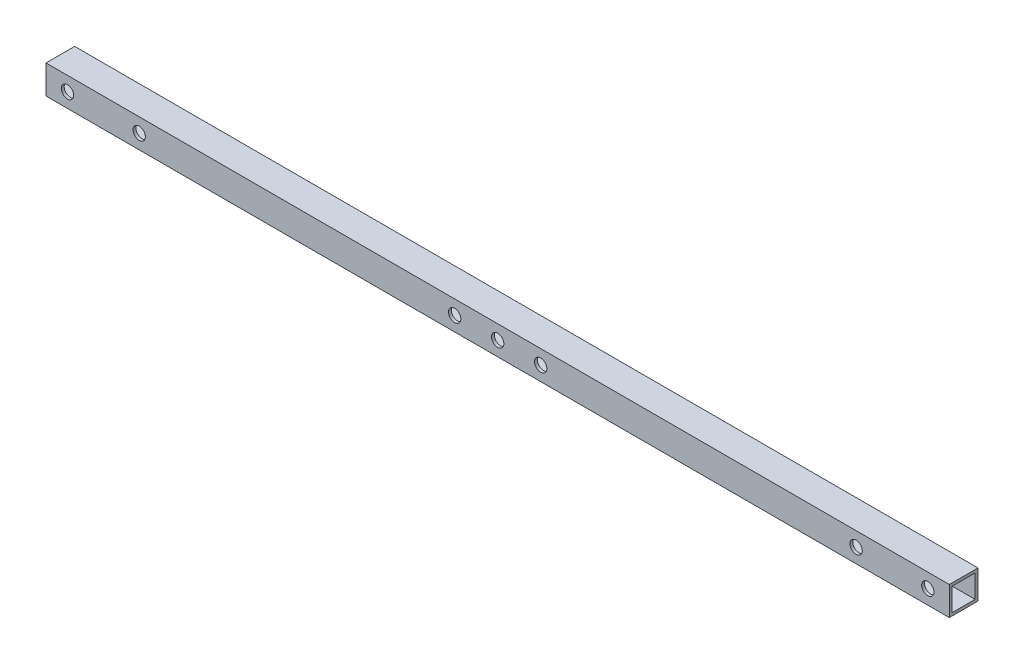
ISO-10303-21;
HEADER;
FILE_DESCRIPTION(('STEP AP214'),'2;1');
FILE_NAME('part.step','',(''),(''),'','','');
FILE_SCHEMA(('AUTOMOTIVE_DESIGN { 1 0 10303 214 1 1 1 1 }'));
ENDSEC;
DATA;
#1=APPLICATION_CONTEXT('core data for automotive mechanical design processes');
#2=APPLICATION_PROTOCOL_DEFINITION('international standard','automotive_design',2000,#1);
#3=PRODUCT_CONTEXT('',#1,'mechanical');
#4=PRODUCT('Part','Part','',(#3));
#5=PRODUCT_RELATED_PRODUCT_CATEGORY('part','',(#4));
#6=PRODUCT_DEFINITION_FORMATION('','',#4);
#7=PRODUCT_DEFINITION_CONTEXT('part definition',#1,'design');
#8=PRODUCT_DEFINITION('design','',#6,#7);
#9=PRODUCT_DEFINITION_SHAPE('','',#8);
#10=(LENGTH_UNIT() NAMED_UNIT(*) SI_UNIT(.MILLI.,.METRE.));
#11=(NAMED_UNIT(*) PLANE_ANGLE_UNIT() SI_UNIT($,.RADIAN.));
#12=(NAMED_UNIT(*) SI_UNIT($,.STERADIAN.) SOLID_ANGLE_UNIT());
#13=UNCERTAINTY_MEASURE_WITH_UNIT(LENGTH_MEASURE(1.E-05),#10,'distance_accuracy_value','');
#14=(GEOMETRIC_REPRESENTATION_CONTEXT(3) GLOBAL_UNCERTAINTY_ASSIGNED_CONTEXT((#13)) GLOBAL_UNIT_ASSIGNED_CONTEXT((#10,
#11,#12)) REPRESENTATION_CONTEXT('',''));
#15=CARTESIAN_POINT('',(0.,0.,0.));
#16=DIRECTION('',(0.,0.,1.));
#17=DIRECTION('',(1.,0.,0.));
#18=AXIS2_PLACEMENT_3D('',#15,#16,#17);
#19=CARTESIAN_POINT('',(315.,0.,0.));
#20=DIRECTION('',(1.,0.,0.));
#21=DIRECTION('',(0.,0.,-1.));
#22=AXIS2_PLACEMENT_3D('',#19,#20,#21);
#23=PLANE('',#22);
#24=DIRECTION('',(0.,1.,0.));
#25=VECTOR('',#24,1.);
#26=CARTESIAN_POINT('',(315.,5.,-5.));
#27=LINE('',#26,#25);
#28=CARTESIAN_POINT('',(315.,-5.,-5.));
#29=VERTEX_POINT('',#28);
#30=CARTESIAN_POINT('',(315.,5.,-5.));
#31=VERTEX_POINT('',#30);
#32=EDGE_CURVE('E164',#29,#31,#27,.T.);
#33=ORIENTED_EDGE('',*,*,#32,.T.);
#34=DIRECTION('',(0.,0.,1.));
#35=VECTOR('',#34,1.);
#36=CARTESIAN_POINT('',(315.,5.,5.));
#37=LINE('',#36,#35);
#38=CARTESIAN_POINT('',(315.,5.,5.));
#39=VERTEX_POINT('',#38);
#40=EDGE_CURVE('E167',#31,#39,#37,.T.);
#41=ORIENTED_EDGE('',*,*,#40,.T.);
#42=DIRECTION('',(0.,-1.,0.));
#43=VECTOR('',#42,1.);
#44=CARTESIAN_POINT('',(315.,5.,5.));
#45=LINE('',#44,#43);
#46=CARTESIAN_POINT('',(315.,-5.,5.));
#47=VERTEX_POINT('',#46);
#48=EDGE_CURVE('E170',#39,#47,#45,.T.);
#49=ORIENTED_EDGE('',*,*,#48,.T.);
#50=DIRECTION('',(0.,0.,-1.));
#51=VECTOR('',#50,1.);
#52=CARTESIAN_POINT('',(315.,-5.,5.));
#53=LINE('',#52,#51);
#54=EDGE_CURVE('E172',#47,#29,#53,.T.);
#55=ORIENTED_EDGE('',*,*,#54,.T.);
#56=EDGE_LOOP('',(#33,#41,#49,#55));
#57=FACE_BOUND('',#56,.T.);
#58=DIRECTION('',(0.,0.,1.));
#59=VECTOR('',#58,1.);
#60=CARTESIAN_POINT('',(315.,4.,5.));
#61=LINE('',#60,#59);
#62=CARTESIAN_POINT('',(315.,4.,-4.));
#63=VERTEX_POINT('',#62);
#64=CARTESIAN_POINT('',(315.,4.,4.));
#65=VERTEX_POINT('',#64);
#66=EDGE_CURVE('E134',#63,#65,#61,.T.);
#67=ORIENTED_EDGE('',*,*,#66,.F.);
#68=DIRECTION('',(0.,1.,0.));
#69=VECTOR('',#68,1.);
#70=CARTESIAN_POINT('',(315.,5.,-4.));
#71=LINE('',#70,#69);
#72=CARTESIAN_POINT('',(315.,-4.,-4.));
#73=VERTEX_POINT('',#72);
#74=EDGE_CURVE('E126',#73,#63,#71,.T.);
#75=ORIENTED_EDGE('',*,*,#74,.F.);
#76=DIRECTION('',(0.,0.,-1.));
#77=VECTOR('',#76,1.);
#78=CARTESIAN_POINT('',(315.,-4.,5.));
#79=LINE('',#78,#77);
#80=CARTESIAN_POINT('',(315.,-4.,4.));
#81=VERTEX_POINT('',#80);
#82=EDGE_CURVE('E148',#81,#73,#79,.T.);
#83=ORIENTED_EDGE('',*,*,#82,.F.);
#84=DIRECTION('',(0.,-1.,0.));
#85=VECTOR('',#84,1.);
#86=CARTESIAN_POINT('',(315.,5.,4.));
#87=LINE('',#86,#85);
#88=EDGE_CURVE('E146',#65,#81,#87,.T.);
#89=ORIENTED_EDGE('',*,*,#88,.F.);
#90=EDGE_LOOP('',(#67,#75,#83,#89));
#91=FACE_BOUND('',#90,.T.);
#92=ADVANCED_FACE('F59',(#57,#91),#23,.T.);
#93=CARTESIAN_POINT('',(0.,0.,0.));
#94=DIRECTION('',(1.,0.,0.));
#95=DIRECTION('',(0.,0.,-1.));
#96=AXIS2_PLACEMENT_3D('',#93,#94,#95);
#97=PLANE('',#96);
#98=DIRECTION('',(0.,1.,0.));
#99=VECTOR('',#98,1.);
#100=CARTESIAN_POINT('',(0.,5.,-5.));
#101=LINE('',#100,#99);
#102=CARTESIAN_POINT('',(0.,-5.,-5.));
#103=VERTEX_POINT('',#102);
#104=CARTESIAN_POINT('',(0.,5.,-5.));
#105=VERTEX_POINT('',#104);
#106=EDGE_CURVE('E142',#103,#105,#101,.T.);
#107=ORIENTED_EDGE('',*,*,#106,.F.);
#108=DIRECTION('',(0.,0.,-1.));
#109=VECTOR('',#108,1.);
#110=CARTESIAN_POINT('',(0.,-5.,5.));
#111=LINE('',#110,#109);
#112=CARTESIAN_POINT('',(0.,-5.,5.));
#113=VERTEX_POINT('',#112);
#114=EDGE_CURVE('E168',#113,#103,#111,.T.);
#115=ORIENTED_EDGE('',*,*,#114,.F.);
#116=DIRECTION('',(0.,-1.,0.));
#117=VECTOR('',#116,1.);
#118=CARTESIAN_POINT('',(0.,5.,5.));
#119=LINE('',#118,#117);
#120=CARTESIAN_POINT('',(0.,5.,5.));
#121=VERTEX_POINT('',#120);
#122=EDGE_CURVE('E179',#121,#113,#119,.T.);
#123=ORIENTED_EDGE('',*,*,#122,.F.);
#124=DIRECTION('',(0.,0.,1.));
#125=VECTOR('',#124,1.);
#126=CARTESIAN_POINT('',(0.,5.,5.));
#127=LINE('',#126,#125);
#128=EDGE_CURVE('E177',#105,#121,#127,.T.);
#129=ORIENTED_EDGE('',*,*,#128,.F.);
#130=EDGE_LOOP('',(#107,#115,#123,#129));
#131=FACE_BOUND('',#130,.T.);
#132=DIRECTION('',(0.,1.,0.));
#133=VECTOR('',#132,1.);
#134=CARTESIAN_POINT('',(0.,5.,-4.));
#135=LINE('',#134,#133);
#136=CARTESIAN_POINT('',(0.,-4.,-4.));
#137=VERTEX_POINT('',#136);
#138=CARTESIAN_POINT('',(0.,4.,-4.));
#139=VERTEX_POINT('',#138);
#140=EDGE_CURVE('E84',#137,#139,#135,.T.);
#141=ORIENTED_EDGE('',*,*,#140,.T.);
#142=DIRECTION('',(0.,0.,1.));
#143=VECTOR('',#142,1.);
#144=CARTESIAN_POINT('',(0.,4.,5.));
#145=LINE('',#144,#143);
#146=CARTESIAN_POINT('',(0.,4.,4.));
#147=VERTEX_POINT('',#146);
#148=EDGE_CURVE('E141',#139,#147,#145,.T.);
#149=ORIENTED_EDGE('',*,*,#148,.T.);
#150=DIRECTION('',(0.,-1.,0.));
#151=VECTOR('',#150,1.);
#152=CARTESIAN_POINT('',(0.,5.,4.));
#153=LINE('',#152,#151);
#154=CARTESIAN_POINT('',(0.,-4.,4.));
#155=VERTEX_POINT('',#154);
#156=EDGE_CURVE('E156',#147,#155,#153,.T.);
#157=ORIENTED_EDGE('',*,*,#156,.T.);
#158=DIRECTION('',(0.,0.,-1.));
#159=VECTOR('',#158,1.);
#160=CARTESIAN_POINT('',(0.,-4.,5.));
#161=LINE('',#160,#159);
#162=EDGE_CURVE('E135',#155,#137,#161,.T.);
#163=ORIENTED_EDGE('',*,*,#162,.T.);
#164=EDGE_LOOP('',(#141,#149,#157,#163));
#165=FACE_BOUND('',#164,.T.);
#166=ADVANCED_FACE('F249',(#131,#165),#97,.F.);
#167=CARTESIAN_POINT('',(315.,5.,-5.));
#168=DIRECTION('',(0.,0.,1.));
#169=DIRECTION('',(0.,-1.,0.));
#170=AXIS2_PLACEMENT_3D('',#167,#168,#169);
#171=PLANE('',#170);
#172=CARTESIAN_POINT('',(307.5,0.,-5.));
#173=DIRECTION('',(0.,0.,1.));
#174=DIRECTION('',(1.,0.,0.));
#175=AXIS2_PLACEMENT_3D('',#172,#173,#174);
#176=CIRCLE('',#175,2.14999999999996);
#177=CARTESIAN_POINT('',(309.65,0.,-5.));
#178=VERTEX_POINT('',#177);
#179=EDGE_CURVE('E193',#178,#178,#176,.T.);
#180=ORIENTED_EDGE('',*,*,#179,.T.);
#181=EDGE_LOOP('',(#180));
#182=FACE_BOUND('',#181,.T.);
#183=CARTESIAN_POINT('',(142.5,0.,-5.));
#184=DIRECTION('',(0.,0.,1.));
#185=DIRECTION('',(-1.,0.,0.));
#186=AXIS2_PLACEMENT_3D('',#183,#184,#185);
#187=CIRCLE('',#186,2.14999999999996);
#188=CARTESIAN_POINT('',(140.35,0.,-5.));
#189=VERTEX_POINT('',#188);
#190=EDGE_CURVE('E306',#189,#189,#187,.T.);
#191=ORIENTED_EDGE('',*,*,#190,.T.);
#192=EDGE_LOOP('',(#191));
#193=FACE_BOUND('',#192,.T.);
#194=CARTESIAN_POINT('',(157.5,0.,-5.));
#195=DIRECTION('',(0.,0.,1.));
#196=DIRECTION('',(1.,0.,0.));
#197=AXIS2_PLACEMENT_3D('',#194,#195,#196);
#198=CIRCLE('',#197,2.15000000000002);
#199=CARTESIAN_POINT('',(159.65,0.,-5.));
#200=VERTEX_POINT('',#199);
#201=EDGE_CURVE('E310',#200,#200,#198,.T.);
#202=ORIENTED_EDGE('',*,*,#201,.T.);
#203=EDGE_LOOP('',(#202));
#204=FACE_BOUND('',#203,.T.);
#205=CARTESIAN_POINT('',(282.5,0.,-5.));
#206=DIRECTION('',(0.,0.,1.));
#207=DIRECTION('',(1.,0.,0.));
#208=AXIS2_PLACEMENT_3D('',#205,#206,#207);
#209=CIRCLE('',#208,2.14999999999996);
#210=CARTESIAN_POINT('',(284.65,0.,-5.));
#211=VERTEX_POINT('',#210);
#212=EDGE_CURVE('E314',#211,#211,#209,.T.);
#213=ORIENTED_EDGE('',*,*,#212,.T.);
#214=EDGE_LOOP('',(#213));
#215=FACE_BOUND('',#214,.T.);
#216=CARTESIAN_POINT('',(7.50000000000001,0.,-5.));
#217=DIRECTION('',(0.,0.,1.));
#218=DIRECTION('',(-1.,0.,0.));
#219=AXIS2_PLACEMENT_3D('',#216,#217,#218);
#220=CIRCLE('',#219,2.14999999999996);
#221=CARTESIAN_POINT('',(5.35000000000005,0.,-5.));
#222=VERTEX_POINT('',#221);
#223=EDGE_CURVE('E318',#222,#222,#220,.T.);
#224=ORIENTED_EDGE('',*,*,#223,.T.);
#225=EDGE_LOOP('',(#224));
#226=FACE_BOUND('',#225,.T.);
#227=CARTESIAN_POINT('',(32.5,0.,-5.));
#228=DIRECTION('',(0.,0.,1.));
#229=DIRECTION('',(-1.,0.,0.));
#230=AXIS2_PLACEMENT_3D('',#227,#228,#229);
#231=CIRCLE('',#230,2.14999999999996);
#232=CARTESIAN_POINT('',(30.3500000000001,0.,-5.));
#233=VERTEX_POINT('',#232);
#234=EDGE_CURVE('E322',#233,#233,#231,.T.);
#235=ORIENTED_EDGE('',*,*,#234,.T.);
#236=EDGE_LOOP('',(#235));
#237=FACE_BOUND('',#236,.T.);
#238=CARTESIAN_POINT('',(172.5,0.,-5.));
#239=DIRECTION('',(0.,0.,1.));
#240=DIRECTION('',(1.,0.,0.));
#241=AXIS2_PLACEMENT_3D('',#238,#239,#240);
#242=CIRCLE('',#241,2.14999999999996);
#243=CARTESIAN_POINT('',(174.65,0.,-5.));
#244=VERTEX_POINT('',#243);
#245=EDGE_CURVE('E325',#244,#244,#242,.T.);
#246=ORIENTED_EDGE('',*,*,#245,.T.);
#247=EDGE_LOOP('',(#246));
#248=FACE_BOUND('',#247,.T.);
#249=ORIENTED_EDGE('',*,*,#106,.T.);
#250=DIRECTION('',(-1.,0.,0.));
#251=VECTOR('',#250,1.);
#252=CARTESIAN_POINT('',(315.,5.,-5.));
#253=LINE('',#252,#251);
#254=EDGE_CURVE('E12',#31,#105,#253,.T.);
#255=ORIENTED_EDGE('',*,*,#254,.F.);
#256=ORIENTED_EDGE('',*,*,#32,.F.);
#257=DIRECTION('',(-1.,0.,0.));
#258=VECTOR('',#257,1.);
#259=CARTESIAN_POINT('',(315.,-5.,-5.));
#260=LINE('',#259,#258);
#261=EDGE_CURVE('E174',#29,#103,#260,.T.);
#262=ORIENTED_EDGE('',*,*,#261,.T.);
#263=EDGE_LOOP('',(#249,#255,#256,#262));
#264=FACE_BOUND('',#263,.T.);
#265=ADVANCED_FACE('F61',(#182,#193,#204,#215,#226,#237,#248,#264),#171,.F.);
#266=CARTESIAN_POINT('',(315.,5.,5.));
#267=DIRECTION('',(0.,-1.,0.));
#268=DIRECTION('',(0.,0.,-1.));
#269=AXIS2_PLACEMENT_3D('',#266,#267,#268);
#270=PLANE('',#269);
#271=ORIENTED_EDGE('',*,*,#128,.T.);
#272=DIRECTION('',(-1.,0.,0.));
#273=VECTOR('',#272,1.);
#274=CARTESIAN_POINT('',(315.,5.,5.));
#275=LINE('',#274,#273);
#276=EDGE_CURVE('E68',#39,#121,#275,.T.);
#277=ORIENTED_EDGE('',*,*,#276,.F.);
#278=ORIENTED_EDGE('',*,*,#40,.F.);
#279=ORIENTED_EDGE('',*,*,#254,.T.);
#280=EDGE_LOOP('',(#271,#277,#278,#279));
#281=FACE_BOUND('',#280,.T.);
#282=ADVANCED_FACE('F278',(#281),#270,.F.);
#283=CARTESIAN_POINT('',(315.,5.,5.));
#284=DIRECTION('',(0.,0.,-1.));
#285=DIRECTION('',(0.,1.,0.));
#286=AXIS2_PLACEMENT_3D('',#283,#284,#285);
#287=PLANE('',#286);
#288=CARTESIAN_POINT('',(307.5,0.,5.));
#289=DIRECTION('',(0.,0.,1.));
#290=DIRECTION('',(1.,0.,0.));
#291=AXIS2_PLACEMENT_3D('',#288,#289,#290);
#292=CIRCLE('',#291,2.14999999999996);
#293=CARTESIAN_POINT('',(309.65,0.,5.));
#294=VERTEX_POINT('',#293);
#295=EDGE_CURVE('E337',#294,#294,#292,.T.);
#296=ORIENTED_EDGE('',*,*,#295,.F.);
#297=EDGE_LOOP('',(#296));
#298=FACE_BOUND('',#297,.T.);
#299=CARTESIAN_POINT('',(142.5,0.,5.));
#300=DIRECTION('',(0.,0.,1.));
#301=DIRECTION('',(-1.,0.,0.));
#302=AXIS2_PLACEMENT_3D('',#299,#300,#301);
#303=CIRCLE('',#302,2.14999999999996);
#304=CARTESIAN_POINT('',(140.35,0.,5.));
#305=VERTEX_POINT('',#304);
#306=EDGE_CURVE('E419',#305,#305,#303,.T.);
#307=ORIENTED_EDGE('',*,*,#306,.F.);
#308=EDGE_LOOP('',(#307));
#309=FACE_BOUND('',#308,.T.);
#310=CARTESIAN_POINT('',(157.5,0.,5.));
#311=DIRECTION('',(0.,0.,1.));
#312=DIRECTION('',(1.,0.,0.));
#313=AXIS2_PLACEMENT_3D('',#310,#311,#312);
#314=CIRCLE('',#313,2.15000000000002);
#315=CARTESIAN_POINT('',(159.65,0.,5.));
#316=VERTEX_POINT('',#315);
#317=EDGE_CURVE('E415',#316,#316,#314,.T.);
#318=ORIENTED_EDGE('',*,*,#317,.F.);
#319=EDGE_LOOP('',(#318));
#320=FACE_BOUND('',#319,.T.);
#321=CARTESIAN_POINT('',(282.5,0.,5.));
#322=DIRECTION('',(0.,0.,1.));
#323=DIRECTION('',(1.,0.,0.));
#324=AXIS2_PLACEMENT_3D('',#321,#322,#323);
#325=CIRCLE('',#324,2.14999999999996);
#326=CARTESIAN_POINT('',(284.65,0.,5.));
#327=VERTEX_POINT('',#326);
#328=EDGE_CURVE('E338',#327,#327,#325,.T.);
#329=ORIENTED_EDGE('',*,*,#328,.F.);
#330=EDGE_LOOP('',(#329));
#331=FACE_BOUND('',#330,.T.);
#332=CARTESIAN_POINT('',(7.50000000000001,0.,5.));
#333=DIRECTION('',(0.,0.,1.));
#334=DIRECTION('',(-1.,0.,0.));
#335=AXIS2_PLACEMENT_3D('',#332,#333,#334);
#336=CIRCLE('',#335,2.14999999999996);
#337=CARTESIAN_POINT('',(5.35000000000005,0.,5.));
#338=VERTEX_POINT('',#337);
#339=EDGE_CURVE('E342',#338,#338,#336,.T.);
#340=ORIENTED_EDGE('',*,*,#339,.F.);
#341=EDGE_LOOP('',(#340));
#342=FACE_BOUND('',#341,.T.);
#343=CARTESIAN_POINT('',(32.5,0.,5.));
#344=DIRECTION('',(0.,0.,1.));
#345=DIRECTION('',(-1.,0.,0.));
#346=AXIS2_PLACEMENT_3D('',#343,#344,#345);
#347=CIRCLE('',#346,2.14999999999996);
#348=CARTESIAN_POINT('',(30.3500000000001,0.,5.));
#349=VERTEX_POINT('',#348);
#350=EDGE_CURVE('E327',#349,#349,#347,.T.);
#351=ORIENTED_EDGE('',*,*,#350,.F.);
#352=EDGE_LOOP('',(#351));
#353=FACE_BOUND('',#352,.T.);
#354=CARTESIAN_POINT('',(172.5,0.,5.));
#355=DIRECTION('',(0.,0.,1.));
#356=DIRECTION('',(1.,0.,0.));
#357=AXIS2_PLACEMENT_3D('',#354,#355,#356);
#358=CIRCLE('',#357,2.14999999999996);
#359=CARTESIAN_POINT('',(174.65,0.,5.));
#360=VERTEX_POINT('',#359);
#361=EDGE_CURVE('E328',#360,#360,#358,.T.);
#362=ORIENTED_EDGE('',*,*,#361,.F.);
#363=EDGE_LOOP('',(#362));
#364=FACE_BOUND('',#363,.T.);
#365=ORIENTED_EDGE('',*,*,#122,.T.);
#366=DIRECTION('',(-1.,0.,0.));
#367=VECTOR('',#366,1.);
#368=CARTESIAN_POINT('',(315.,-5.,5.));
#369=LINE('',#368,#367);
#370=EDGE_CURVE('E184',#47,#113,#369,.T.);
#371=ORIENTED_EDGE('',*,*,#370,.F.);
#372=ORIENTED_EDGE('',*,*,#48,.F.);
#373=ORIENTED_EDGE('',*,*,#276,.T.);
#374=EDGE_LOOP('',(#365,#371,#372,#373));
#375=FACE_BOUND('',#374,.T.);
#376=ADVANCED_FACE('F275',(#298,#309,#320,#331,#342,#353,#364,#375),#287,.F.);
#377=CARTESIAN_POINT('',(315.,-5.,5.));
#378=DIRECTION('',(0.,1.,0.));
#379=DIRECTION('',(0.,0.,1.));
#380=AXIS2_PLACEMENT_3D('',#377,#378,#379);
#381=PLANE('',#380);
#382=ORIENTED_EDGE('',*,*,#114,.T.);
#383=ORIENTED_EDGE('',*,*,#261,.F.);
#384=ORIENTED_EDGE('',*,*,#54,.F.);
#385=ORIENTED_EDGE('',*,*,#370,.T.);
#386=EDGE_LOOP('',(#382,#383,#384,#385));
#387=FACE_BOUND('',#386,.T.);
#388=ADVANCED_FACE('F272',(#387),#381,.F.);
#389=CARTESIAN_POINT('',(315.,5.,-4.));
#390=DIRECTION('',(0.,0.,1.));
#391=DIRECTION('',(0.,-1.,0.));
#392=AXIS2_PLACEMENT_3D('',#389,#390,#391);
#393=PLANE('',#392);
#394=CARTESIAN_POINT('',(307.5,0.,-4.));
#395=DIRECTION('',(0.,0.,1.));
#396=DIRECTION('',(0.,-1.,0.));
#397=AXIS2_PLACEMENT_3D('',#394,#395,#396);
#398=CIRCLE('',#397,2.14999999999996);
#399=CARTESIAN_POINT('',(307.5,-2.14999999999998,-4.));
#400=VERTEX_POINT('',#399);
#401=EDGE_CURVE('E154',#400,#400,#398,.T.);
#402=ORIENTED_EDGE('',*,*,#401,.F.);
#403=EDGE_LOOP('',(#402));
#404=FACE_BOUND('',#403,.T.);
#405=CARTESIAN_POINT('',(142.5,0.,-4.));
#406=DIRECTION('',(0.,0.,1.));
#407=DIRECTION('',(0.,-1.,0.));
#408=AXIS2_PLACEMENT_3D('',#405,#406,#407);
#409=CIRCLE('',#408,2.14999999999996);
#410=CARTESIAN_POINT('',(142.5,-2.14999999999996,-4.));
#411=VERTEX_POINT('',#410);
#412=EDGE_CURVE('E211',#411,#411,#409,.T.);
#413=ORIENTED_EDGE('',*,*,#412,.F.);
#414=EDGE_LOOP('',(#413));
#415=FACE_BOUND('',#414,.T.);
#416=CARTESIAN_POINT('',(157.5,0.,-4.));
#417=DIRECTION('',(0.,0.,1.));
#418=DIRECTION('',(0.,-1.,0.));
#419=AXIS2_PLACEMENT_3D('',#416,#417,#418);
#420=CIRCLE('',#419,2.15000000000002);
#421=CARTESIAN_POINT('',(157.5,-2.15000000000002,-4.));
#422=VERTEX_POINT('',#421);
#423=EDGE_CURVE('E208',#422,#422,#420,.T.);
#424=ORIENTED_EDGE('',*,*,#423,.F.);
#425=EDGE_LOOP('',(#424));
#426=FACE_BOUND('',#425,.T.);
#427=CARTESIAN_POINT('',(282.5,0.,-4.));
#428=DIRECTION('',(0.,0.,1.));
#429=DIRECTION('',(0.,-1.,0.));
#430=AXIS2_PLACEMENT_3D('',#427,#428,#429);
#431=CIRCLE('',#430,2.14999999999996);
#432=CARTESIAN_POINT('',(282.5,-2.14999999999998,-4.));
#433=VERTEX_POINT('',#432);
#434=EDGE_CURVE('E205',#433,#433,#431,.T.);
#435=ORIENTED_EDGE('',*,*,#434,.F.);
#436=EDGE_LOOP('',(#435));
#437=FACE_BOUND('',#436,.T.);
#438=CARTESIAN_POINT('',(7.50000000000001,0.,-4.));
#439=DIRECTION('',(0.,0.,1.));
#440=DIRECTION('',(0.,-1.,0.));
#441=AXIS2_PLACEMENT_3D('',#438,#439,#440);
#442=CIRCLE('',#441,2.14999999999996);
#443=CARTESIAN_POINT('',(7.50000000000001,-2.14999999999996,-4.));
#444=VERTEX_POINT('',#443);
#445=EDGE_CURVE('E201',#444,#444,#442,.T.);
#446=ORIENTED_EDGE('',*,*,#445,.F.);
#447=EDGE_LOOP('',(#446));
#448=FACE_BOUND('',#447,.T.);
#449=CARTESIAN_POINT('',(32.5,0.,-4.));
#450=DIRECTION('',(0.,0.,1.));
#451=DIRECTION('',(0.,-1.,0.));
#452=AXIS2_PLACEMENT_3D('',#449,#450,#451);
#453=CIRCLE('',#452,2.14999999999996);
#454=CARTESIAN_POINT('',(32.5,-2.14999999999996,-4.));
#455=VERTEX_POINT('',#454);
#456=EDGE_CURVE('E197',#455,#455,#453,.T.);
#457=ORIENTED_EDGE('',*,*,#456,.F.);
#458=EDGE_LOOP('',(#457));
#459=FACE_BOUND('',#458,.T.);
#460=CARTESIAN_POINT('',(172.5,0.,-4.));
#461=DIRECTION('',(0.,0.,1.));
#462=DIRECTION('',(0.,-1.,0.));
#463=AXIS2_PLACEMENT_3D('',#460,#461,#462);
#464=CIRCLE('',#463,2.14999999999996);
#465=CARTESIAN_POINT('',(172.5,-2.14999999999996,-4.));
#466=VERTEX_POINT('',#465);
#467=EDGE_CURVE('E192',#466,#466,#464,.T.);
#468=ORIENTED_EDGE('',*,*,#467,.F.);
#469=EDGE_LOOP('',(#468));
#470=FACE_BOUND('',#469,.T.);
#471=ORIENTED_EDGE('',*,*,#140,.F.);
#472=DIRECTION('',(-1.,0.,0.));
#473=VECTOR('',#472,1.);
#474=CARTESIAN_POINT('',(315.,-4.,-4.));
#475=LINE('',#474,#473);
#476=EDGE_CURVE('E130',#73,#137,#475,.T.);
#477=ORIENTED_EDGE('',*,*,#476,.F.);
#478=ORIENTED_EDGE('',*,*,#74,.T.);
#479=DIRECTION('',(-1.,0.,0.));
#480=VECTOR('',#479,1.);
#481=CARTESIAN_POINT('',(315.,4.,-4.));
#482=LINE('',#481,#480);
#483=EDGE_CURVE('E129',#63,#139,#482,.T.);
#484=ORIENTED_EDGE('',*,*,#483,.T.);
#485=EDGE_LOOP('',(#471,#477,#478,#484));
#486=FACE_BOUND('',#485,.T.);
#487=ADVANCED_FACE('F128',(#404,#415,#426,#437,#448,#459,#470,#486),#393,.T.);
#488=CARTESIAN_POINT('',(315.,4.,5.));
#489=DIRECTION('',(0.,-1.,0.));
#490=DIRECTION('',(0.,0.,-1.));
#491=AXIS2_PLACEMENT_3D('',#488,#489,#490);
#492=PLANE('',#491);
#493=ORIENTED_EDGE('',*,*,#148,.F.);
#494=ORIENTED_EDGE('',*,*,#483,.F.);
#495=ORIENTED_EDGE('',*,*,#66,.T.);
#496=DIRECTION('',(-1.,0.,0.));
#497=VECTOR('',#496,1.);
#498=CARTESIAN_POINT('',(315.,4.,4.));
#499=LINE('',#498,#497);
#500=EDGE_CURVE('E143',#65,#147,#499,.T.);
#501=ORIENTED_EDGE('',*,*,#500,.T.);
#502=EDGE_LOOP('',(#493,#494,#495,#501));
#503=FACE_BOUND('',#502,.T.);
#504=ADVANCED_FACE('F138',(#503),#492,.T.);
#505=CARTESIAN_POINT('',(315.,5.,4.));
#506=DIRECTION('',(0.,0.,-1.));
#507=DIRECTION('',(0.,1.,0.));
#508=AXIS2_PLACEMENT_3D('',#505,#506,#507);
#509=PLANE('',#508);
#510=CARTESIAN_POINT('',(307.5,0.,4.));
#511=DIRECTION('',(0.,0.,-1.));
#512=DIRECTION('',(0.,1.,0.));
#513=AXIS2_PLACEMENT_3D('',#510,#511,#512);
#514=CIRCLE('',#513,2.14999999999996);
#515=CARTESIAN_POINT('',(307.5,2.14999999999994,4.));
#516=VERTEX_POINT('',#515);
#517=EDGE_CURVE('E63',#516,#516,#514,.T.);
#518=ORIENTED_EDGE('',*,*,#517,.F.);
#519=EDGE_LOOP('',(#518));
#520=FACE_BOUND('',#519,.T.);
#521=CARTESIAN_POINT('',(142.5,0.,4.));
#522=DIRECTION('',(0.,0.,-1.));
#523=DIRECTION('',(0.,1.,0.));
#524=AXIS2_PLACEMENT_3D('',#521,#522,#523);
#525=CIRCLE('',#524,2.14999999999996);
#526=CARTESIAN_POINT('',(142.5,2.14999999999995,4.));
#527=VERTEX_POINT('',#526);
#528=EDGE_CURVE('E209',#527,#527,#525,.T.);
#529=ORIENTED_EDGE('',*,*,#528,.F.);
#530=EDGE_LOOP('',(#529));
#531=FACE_BOUND('',#530,.T.);
#532=CARTESIAN_POINT('',(157.5,0.,4.));
#533=DIRECTION('',(0.,0.,-1.));
#534=DIRECTION('',(0.,1.,0.));
#535=AXIS2_PLACEMENT_3D('',#532,#533,#534);
#536=CIRCLE('',#535,2.15000000000002);
#537=CARTESIAN_POINT('',(157.5,2.15000000000002,4.));
#538=VERTEX_POINT('',#537);
#539=EDGE_CURVE('E206',#538,#538,#536,.T.);
#540=ORIENTED_EDGE('',*,*,#539,.F.);
#541=EDGE_LOOP('',(#540));
#542=FACE_BOUND('',#541,.T.);
#543=CARTESIAN_POINT('',(282.5,0.,4.));
#544=DIRECTION('',(0.,0.,-1.));
#545=DIRECTION('',(0.,1.,0.));
#546=AXIS2_PLACEMENT_3D('',#543,#544,#545);
#547=CIRCLE('',#546,2.14999999999996);
#548=CARTESIAN_POINT('',(282.5,2.14999999999994,4.));
#549=VERTEX_POINT('',#548);
#550=EDGE_CURVE('E202',#549,#549,#547,.T.);
#551=ORIENTED_EDGE('',*,*,#550,.F.);
#552=EDGE_LOOP('',(#551));
#553=FACE_BOUND('',#552,.T.);
#554=CARTESIAN_POINT('',(7.50000000000001,0.,4.));
#555=DIRECTION('',(0.,0.,-1.));
#556=DIRECTION('',(0.,1.,0.));
#557=AXIS2_PLACEMENT_3D('',#554,#555,#556);
#558=CIRCLE('',#557,2.14999999999996);
#559=CARTESIAN_POINT('',(7.50000000000001,2.14999999999996,4.));
#560=VERTEX_POINT('',#559);
#561=EDGE_CURVE('E198',#560,#560,#558,.T.);
#562=ORIENTED_EDGE('',*,*,#561,.F.);
#563=EDGE_LOOP('',(#562));
#564=FACE_BOUND('',#563,.T.);
#565=CARTESIAN_POINT('',(32.5,0.,4.));
#566=DIRECTION('',(0.,0.,-1.));
#567=DIRECTION('',(0.,1.,0.));
#568=AXIS2_PLACEMENT_3D('',#565,#566,#567);
#569=CIRCLE('',#568,2.14999999999996);
#570=CARTESIAN_POINT('',(32.5,2.14999999999996,4.));
#571=VERTEX_POINT('',#570);
#572=EDGE_CURVE('E194',#571,#571,#569,.T.);
#573=ORIENTED_EDGE('',*,*,#572,.F.);
#574=EDGE_LOOP('',(#573));
#575=FACE_BOUND('',#574,.T.);
#576=CARTESIAN_POINT('',(172.5,0.,4.));
#577=DIRECTION('',(0.,0.,-1.));
#578=DIRECTION('',(0.,1.,0.));
#579=AXIS2_PLACEMENT_3D('',#576,#577,#578);
#580=CIRCLE('',#579,2.14999999999996);
#581=CARTESIAN_POINT('',(172.5,2.14999999999996,4.));
#582=VERTEX_POINT('',#581);
#583=EDGE_CURVE('E189',#582,#582,#580,.T.);
#584=ORIENTED_EDGE('',*,*,#583,.F.);
#585=EDGE_LOOP('',(#584));
#586=FACE_BOUND('',#585,.T.);
#587=ORIENTED_EDGE('',*,*,#156,.F.);
#588=ORIENTED_EDGE('',*,*,#500,.F.);
#589=ORIENTED_EDGE('',*,*,#88,.T.);
#590=DIRECTION('',(-1.,0.,0.));
#591=VECTOR('',#590,1.);
#592=CARTESIAN_POINT('',(315.,-4.,4.));
#593=LINE('',#592,#591);
#594=EDGE_CURVE('E76',#81,#155,#593,.T.);
#595=ORIENTED_EDGE('',*,*,#594,.T.);
#596=EDGE_LOOP('',(#587,#588,#589,#595));
#597=FACE_BOUND('',#596,.T.);
#598=ADVANCED_FACE('F231',(#520,#531,#542,#553,#564,#575,#586,#597),#509,.T.);
#599=CARTESIAN_POINT('',(315.,-4.,5.));
#600=DIRECTION('',(0.,1.,0.));
#601=DIRECTION('',(0.,0.,1.));
#602=AXIS2_PLACEMENT_3D('',#599,#600,#601);
#603=PLANE('',#602);
#604=ORIENTED_EDGE('',*,*,#162,.F.);
#605=ORIENTED_EDGE('',*,*,#594,.F.);
#606=ORIENTED_EDGE('',*,*,#82,.T.);
#607=ORIENTED_EDGE('',*,*,#476,.T.);
#608=EDGE_LOOP('',(#604,#605,#606,#607));
#609=FACE_BOUND('',#608,.T.);
#610=ADVANCED_FACE('F234',(#609),#603,.T.);
#611=CARTESIAN_POINT('',(172.5,0.,-5.));
#612=DIRECTION('',(0.,0.,1.));
#613=DIRECTION('',(1.,0.,0.));
#614=AXIS2_PLACEMENT_3D('',#611,#612,#613);
#615=CYLINDRICAL_SURFACE('',#614,2.14999999999996);
#616=ORIENTED_EDGE('',*,*,#583,.T.);
#617=EDGE_LOOP('',(#616));
#618=FACE_BOUND('',#617,.T.);
#619=ORIENTED_EDGE('',*,*,#361,.T.);
#620=EDGE_LOOP('',(#619));
#621=FACE_BOUND('',#620,.T.);
#622=ADVANCED_FACE('F251',(#618,#621),#615,.F.);
#623=CARTESIAN_POINT('',(32.5,0.,-5.));
#624=DIRECTION('',(0.,0.,1.));
#625=DIRECTION('',(1.,0.,0.));
#626=AXIS2_PLACEMENT_3D('',#623,#624,#625);
#627=CYLINDRICAL_SURFACE('',#626,2.14999999999996);
#628=ORIENTED_EDGE('',*,*,#572,.T.);
#629=EDGE_LOOP('',(#628));
#630=FACE_BOUND('',#629,.T.);
#631=ORIENTED_EDGE('',*,*,#350,.T.);
#632=EDGE_LOOP('',(#631));
#633=FACE_BOUND('',#632,.T.);
#634=ADVANCED_FACE('F256',(#630,#633),#627,.F.);
#635=CARTESIAN_POINT('',(7.50000000000001,0.,-5.));
#636=DIRECTION('',(0.,0.,1.));
#637=DIRECTION('',(1.,0.,0.));
#638=AXIS2_PLACEMENT_3D('',#635,#636,#637);
#639=CYLINDRICAL_SURFACE('',#638,2.14999999999996);
#640=ORIENTED_EDGE('',*,*,#561,.T.);
#641=EDGE_LOOP('',(#640));
#642=FACE_BOUND('',#641,.T.);
#643=ORIENTED_EDGE('',*,*,#339,.T.);
#644=EDGE_LOOP('',(#643));
#645=FACE_BOUND('',#644,.T.);
#646=ADVANCED_FACE('F377',(#642,#645),#639,.F.);
#647=CARTESIAN_POINT('',(282.5,0.,-5.));
#648=DIRECTION('',(0.,0.,1.));
#649=DIRECTION('',(1.,0.,0.));
#650=AXIS2_PLACEMENT_3D('',#647,#648,#649);
#651=CYLINDRICAL_SURFACE('',#650,2.14999999999996);
#652=ORIENTED_EDGE('',*,*,#550,.T.);
#653=EDGE_LOOP('',(#652));
#654=FACE_BOUND('',#653,.T.);
#655=ORIENTED_EDGE('',*,*,#328,.T.);
#656=EDGE_LOOP('',(#655));
#657=FACE_BOUND('',#656,.T.);
#658=ADVANCED_FACE('F374',(#654,#657),#651,.F.);
#659=CARTESIAN_POINT('',(157.5,0.,-5.));
#660=DIRECTION('',(0.,0.,1.));
#661=DIRECTION('',(1.,0.,0.));
#662=AXIS2_PLACEMENT_3D('',#659,#660,#661);
#663=CYLINDRICAL_SURFACE('',#662,2.15000000000002);
#664=ORIENTED_EDGE('',*,*,#539,.T.);
#665=EDGE_LOOP('',(#664));
#666=FACE_BOUND('',#665,.T.);
#667=ORIENTED_EDGE('',*,*,#317,.T.);
#668=EDGE_LOOP('',(#667));
#669=FACE_BOUND('',#668,.T.);
#670=ADVANCED_FACE('F376',(#666,#669),#663,.F.);
#671=CARTESIAN_POINT('',(142.5,0.,-5.));
#672=DIRECTION('',(0.,0.,1.));
#673=DIRECTION('',(1.,0.,0.));
#674=AXIS2_PLACEMENT_3D('',#671,#672,#673);
#675=CYLINDRICAL_SURFACE('',#674,2.14999999999996);
#676=ORIENTED_EDGE('',*,*,#528,.T.);
#677=EDGE_LOOP('',(#676));
#678=FACE_BOUND('',#677,.T.);
#679=ORIENTED_EDGE('',*,*,#306,.T.);
#680=EDGE_LOOP('',(#679));
#681=FACE_BOUND('',#680,.T.);
#682=ADVANCED_FACE('F369',(#678,#681),#675,.F.);
#683=CARTESIAN_POINT('',(307.5,0.,-5.));
#684=DIRECTION('',(0.,0.,1.));
#685=DIRECTION('',(1.,0.,0.));
#686=AXIS2_PLACEMENT_3D('',#683,#684,#685);
#687=CYLINDRICAL_SURFACE('',#686,2.14999999999996);
#688=ORIENTED_EDGE('',*,*,#517,.T.);
#689=EDGE_LOOP('',(#688));
#690=FACE_BOUND('',#689,.T.);
#691=ORIENTED_EDGE('',*,*,#295,.T.);
#692=EDGE_LOOP('',(#691));
#693=FACE_BOUND('',#692,.T.);
#694=ADVANCED_FACE('F228',(#690,#693),#687,.F.);
#695=ORIENTED_EDGE('',*,*,#467,.T.);
#696=EDGE_LOOP('',(#695));
#697=FACE_BOUND('',#696,.T.);
#698=ORIENTED_EDGE('',*,*,#245,.F.);
#699=EDGE_LOOP('',(#698));
#700=FACE_BOUND('',#699,.T.);
#701=ADVANCED_FACE('F259',(#697,#700),#615,.F.);
#702=ORIENTED_EDGE('',*,*,#456,.T.);
#703=EDGE_LOOP('',(#702));
#704=FACE_BOUND('',#703,.T.);
#705=ORIENTED_EDGE('',*,*,#234,.F.);
#706=EDGE_LOOP('',(#705));
#707=FACE_BOUND('',#706,.T.);
#708=ADVANCED_FACE('F362',(#704,#707),#627,.F.);
#709=ORIENTED_EDGE('',*,*,#445,.T.);
#710=EDGE_LOOP('',(#709));
#711=FACE_BOUND('',#710,.T.);
#712=ORIENTED_EDGE('',*,*,#223,.F.);
#713=EDGE_LOOP('',(#712));
#714=FACE_BOUND('',#713,.T.);
#715=ADVANCED_FACE('F351',(#711,#714),#639,.F.);
#716=ORIENTED_EDGE('',*,*,#434,.T.);
#717=EDGE_LOOP('',(#716));
#718=FACE_BOUND('',#717,.T.);
#719=ORIENTED_EDGE('',*,*,#212,.F.);
#720=EDGE_LOOP('',(#719));
#721=FACE_BOUND('',#720,.T.);
#722=ADVANCED_FACE('F379',(#718,#721),#651,.F.);
#723=ORIENTED_EDGE('',*,*,#423,.T.);
#724=EDGE_LOOP('',(#723));
#725=FACE_BOUND('',#724,.T.);
#726=ORIENTED_EDGE('',*,*,#201,.F.);
#727=EDGE_LOOP('',(#726));
#728=FACE_BOUND('',#727,.T.);
#729=ADVANCED_FACE('F391',(#725,#728),#663,.F.);
#730=ORIENTED_EDGE('',*,*,#412,.T.);
#731=EDGE_LOOP('',(#730));
#732=FACE_BOUND('',#731,.T.);
#733=ORIENTED_EDGE('',*,*,#190,.F.);
#734=EDGE_LOOP('',(#733));
#735=FACE_BOUND('',#734,.T.);
#736=ADVANCED_FACE('F396',(#732,#735),#675,.F.);
#737=ORIENTED_EDGE('',*,*,#401,.T.);
#738=EDGE_LOOP('',(#737));
#739=FACE_BOUND('',#738,.T.);
#740=ORIENTED_EDGE('',*,*,#179,.F.);
#741=EDGE_LOOP('',(#740));
#742=FACE_BOUND('',#741,.T.);
#743=ADVANCED_FACE('F371',(#739,#742),#687,.F.);
#744=CLOSED_SHELL('',(#92,#166,#265,#282,#376,#388,#487,#504,#598,#610,#622,#634,#646,#658,#670,
#682,#694,#701,#708,#715,#722,#729,#736,#743));
#745=MANIFOLD_SOLID_BREP('B2',#744);
#746=ADVANCED_BREP_SHAPE_REPRESENTATION('',(#18,#745),#14);
#747=SHAPE_DEFINITION_REPRESENTATION(#9,#746);
ENDSEC;
END-ISO-10303-21;
